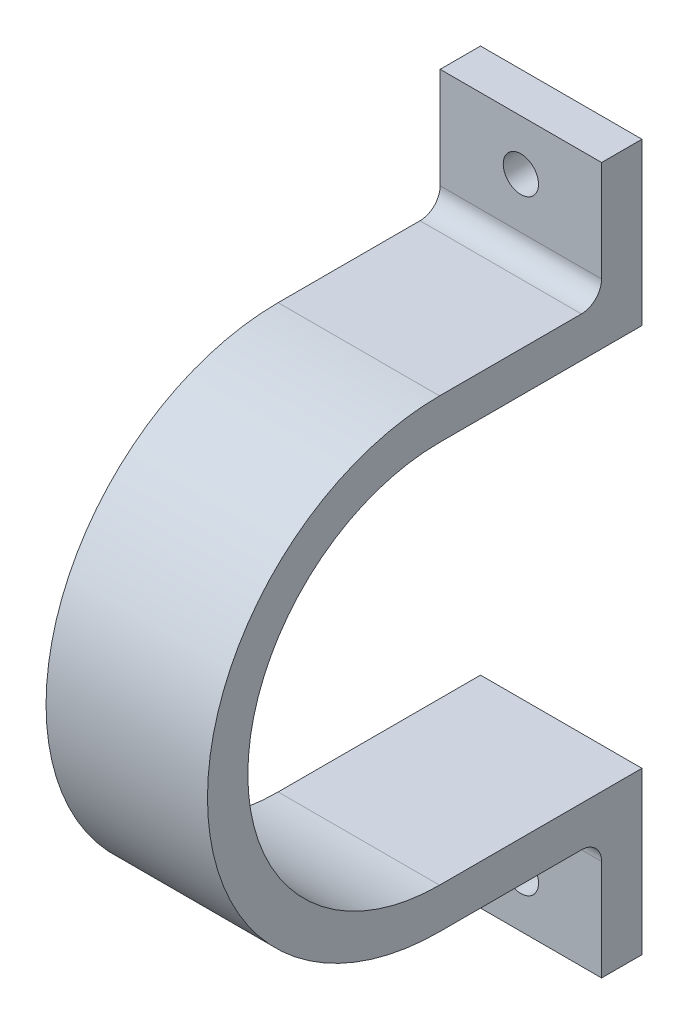
ISO-10303-21;
HEADER;
FILE_DESCRIPTION(('STEP AP214'),'2;1');
FILE_NAME('part.step','',(''),(''),'','','');
FILE_SCHEMA(('AUTOMOTIVE_DESIGN { 1 0 10303 214 1 1 1 1 }'));
ENDSEC;
DATA;
#1=APPLICATION_CONTEXT('core data for automotive mechanical design processes');
#2=APPLICATION_PROTOCOL_DEFINITION('international standard','automotive_design',2000,#1);
#3=PRODUCT_CONTEXT('',#1,'mechanical');
#4=PRODUCT('Part','Part','',(#3));
#5=PRODUCT_RELATED_PRODUCT_CATEGORY('part','',(#4));
#6=PRODUCT_DEFINITION_FORMATION('','',#4);
#7=PRODUCT_DEFINITION_CONTEXT('part definition',#1,'design');
#8=PRODUCT_DEFINITION('design','',#6,#7);
#9=PRODUCT_DEFINITION_SHAPE('','',#8);
#10=(LENGTH_UNIT() NAMED_UNIT(*) SI_UNIT(.MILLI.,.METRE.));
#11=(NAMED_UNIT(*) PLANE_ANGLE_UNIT() SI_UNIT($,.RADIAN.));
#12=(NAMED_UNIT(*) SI_UNIT($,.STERADIAN.) SOLID_ANGLE_UNIT());
#13=UNCERTAINTY_MEASURE_WITH_UNIT(LENGTH_MEASURE(1.E-05),#10,'distance_accuracy_value','');
#14=(GEOMETRIC_REPRESENTATION_CONTEXT(3) GLOBAL_UNCERTAINTY_ASSIGNED_CONTEXT((#13)) GLOBAL_UNIT_ASSIGNED_CONTEXT((#10,
#11,#12)) REPRESENTATION_CONTEXT('',''));
#15=CARTESIAN_POINT('',(0.,0.,0.));
#16=DIRECTION('',(0.,0.,1.));
#17=DIRECTION('',(1.,0.,0.));
#18=AXIS2_PLACEMENT_3D('',#15,#16,#17);
#19=CARTESIAN_POINT('',(16.,16.,0.));
#20=DIRECTION('',(0.,0.,1.));
#21=DIRECTION('',(0.,-1.,0.));
#22=AXIS2_PLACEMENT_3D('',#19,#20,#21);
#23=PLANE('',#22);
#24=CARTESIAN_POINT('',(8.,11.,0.));
#25=DIRECTION('',(0.,0.,-1.));
#26=DIRECTION('',(0.,-1.,0.));
#27=AXIS2_PLACEMENT_3D('',#24,#25,#26);
#28=CIRCLE('',#27,1.75);
#29=CARTESIAN_POINT('',(8.,9.24999999999999,0.));
#30=VERTEX_POINT('',#29);
#31=EDGE_CURVE('E326',#30,#30,#28,.T.);
#32=ORIENTED_EDGE('',*,*,#31,.F.);
#33=EDGE_LOOP('',(#32));
#34=FACE_BOUND('',#33,.T.);
#35=DIRECTION('',(0.,1.,0.));
#36=VECTOR('',#35,1.);
#37=CARTESIAN_POINT('',(0.,16.,0.));
#38=LINE('',#37,#36);
#39=CARTESIAN_POINT('',(0.,0.,0.));
#40=VERTEX_POINT('',#39);
#41=CARTESIAN_POINT('',(0.,16.,0.));
#42=VERTEX_POINT('',#41);
#43=EDGE_CURVE('E173',#40,#42,#38,.T.);
#44=ORIENTED_EDGE('',*,*,#43,.T.);
#45=DIRECTION('',(-1.,0.,0.));
#46=VECTOR('',#45,1.);
#47=CARTESIAN_POINT('',(16.,16.,0.));
#48=LINE('',#47,#46);
#49=CARTESIAN_POINT('',(16.,16.,0.));
#50=VERTEX_POINT('',#49);
#51=EDGE_CURVE('E151',#50,#42,#48,.T.);
#52=ORIENTED_EDGE('',*,*,#51,.F.);
#53=DIRECTION('',(0.,1.,0.));
#54=VECTOR('',#53,1.);
#55=CARTESIAN_POINT('',(16.,16.,0.));
#56=LINE('',#55,#54);
#57=CARTESIAN_POINT('',(16.,0.,0.));
#58=VERTEX_POINT('',#57);
#59=EDGE_CURVE('E160',#58,#50,#56,.T.);
#60=ORIENTED_EDGE('',*,*,#59,.F.);
#61=DIRECTION('',(-1.,0.,0.));
#62=VECTOR('',#61,1.);
#63=CARTESIAN_POINT('',(16.,0.,0.));
#64=LINE('',#63,#62);
#65=EDGE_CURVE('E256',#58,#40,#64,.T.);
#66=ORIENTED_EDGE('',*,*,#65,.T.);
#67=EDGE_LOOP('',(#44,#52,#60,#66));
#68=FACE_BOUND('',#67,.T.);
#69=ADVANCED_FACE('F45',(#34,#68),#23,.F.);
#70=CARTESIAN_POINT('',(16.,16.,4.));
#71=DIRECTION('',(0.,-1.,0.));
#72=DIRECTION('',(0.,0.,-1.));
#73=AXIS2_PLACEMENT_3D('',#70,#71,#72);
#74=PLANE('',#73);
#75=DIRECTION('',(0.,0.,1.));
#76=VECTOR('',#75,1.);
#77=CARTESIAN_POINT('',(0.,16.,4.));
#78=LINE('',#77,#76);
#79=CARTESIAN_POINT('',(0.,16.,4.));
#80=VERTEX_POINT('',#79);
#81=EDGE_CURVE('E225',#42,#80,#78,.T.);
#82=ORIENTED_EDGE('',*,*,#81,.T.);
#83=DIRECTION('',(-1.,0.,0.));
#84=VECTOR('',#83,1.);
#85=CARTESIAN_POINT('',(16.,16.,4.));
#86=LINE('',#85,#84);
#87=CARTESIAN_POINT('',(16.,16.,4.));
#88=VERTEX_POINT('',#87);
#89=EDGE_CURVE('E154',#88,#80,#86,.T.);
#90=ORIENTED_EDGE('',*,*,#89,.F.);
#91=DIRECTION('',(0.,0.,1.));
#92=VECTOR('',#91,1.);
#93=CARTESIAN_POINT('',(16.,16.,4.));
#94=LINE('',#93,#92);
#95=EDGE_CURVE('E147',#50,#88,#94,.T.);
#96=ORIENTED_EDGE('',*,*,#95,.F.);
#97=ORIENTED_EDGE('',*,*,#51,.T.);
#98=EDGE_LOOP('',(#82,#90,#96,#97));
#99=FACE_BOUND('',#98,.T.);
#100=ADVANCED_FACE('F149',(#99),#74,.F.);
#101=CARTESIAN_POINT('',(16.,4.,4.));
#102=DIRECTION('',(0.,0.,-1.));
#103=DIRECTION('',(0.,1.,0.));
#104=AXIS2_PLACEMENT_3D('',#101,#102,#103);
#105=PLANE('',#104);
#106=CARTESIAN_POINT('',(8.,11.,4.));
#107=DIRECTION('',(0.,0.,-1.));
#108=DIRECTION('',(0.,1.,0.));
#109=AXIS2_PLACEMENT_3D('',#106,#107,#108);
#110=CIRCLE('',#109,1.75);
#111=CARTESIAN_POINT('',(8.,12.75,4.));
#112=VERTEX_POINT('',#111);
#113=EDGE_CURVE('E329',#112,#112,#110,.F.);
#114=ORIENTED_EDGE('',*,*,#113,.F.);
#115=EDGE_LOOP('',(#114));
#116=FACE_BOUND('',#115,.T.);
#117=DIRECTION('',(0.,-1.,0.));
#118=VECTOR('',#117,1.);
#119=CARTESIAN_POINT('',(0.,4.,4.));
#120=LINE('',#119,#118);
#121=CARTESIAN_POINT('',(0.,6.,4.));
#122=VERTEX_POINT('',#121);
#123=EDGE_CURVE('E219',#80,#122,#120,.T.);
#124=ORIENTED_EDGE('',*,*,#123,.T.);
#125=DIRECTION('',(-1.,0.,0.));
#126=VECTOR('',#125,1.);
#127=CARTESIAN_POINT('',(16.,6.,4.));
#128=LINE('',#127,#126);
#129=CARTESIAN_POINT('',(16.,6.,4.));
#130=VERTEX_POINT('',#129);
#131=EDGE_CURVE('E180',#122,#130,#128,.F.);
#132=ORIENTED_EDGE('',*,*,#131,.T.);
#133=DIRECTION('',(0.,-1.,0.));
#134=VECTOR('',#133,1.);
#135=CARTESIAN_POINT('',(16.,4.,4.));
#136=LINE('',#135,#134);
#137=EDGE_CURVE('E159',#88,#130,#136,.T.);
#138=ORIENTED_EDGE('',*,*,#137,.F.);
#139=ORIENTED_EDGE('',*,*,#89,.T.);
#140=EDGE_LOOP('',(#124,#132,#138,#139));
#141=FACE_BOUND('',#140,.T.);
#142=ADVANCED_FACE('F223',(#116,#141),#105,.F.);
#143=CARTESIAN_POINT('',(16.,4.,20.0623887896835));
#144=DIRECTION('',(0.,-1.,0.));
#145=DIRECTION('',(0.,0.,-1.));
#146=AXIS2_PLACEMENT_3D('',#143,#144,#145);
#147=PLANE('',#146);
#148=DIRECTION('',(0.,0.,1.));
#149=VECTOR('',#148,1.);
#150=CARTESIAN_POINT('',(16.,4.,20.0623887896835));
#151=LINE('',#150,#149);
#152=CARTESIAN_POINT('',(16.,4.,6.));
#153=VERTEX_POINT('',#152);
#154=CARTESIAN_POINT('',(16.,3.99999999999999,20.0623887896835));
#155=VERTEX_POINT('',#154);
#156=EDGE_CURVE('E202',#153,#155,#151,.T.);
#157=ORIENTED_EDGE('',*,*,#156,.F.);
#158=DIRECTION('',(-1.,0.,0.));
#159=VECTOR('',#158,1.);
#160=CARTESIAN_POINT('',(0.,4.,6.));
#161=LINE('',#160,#159);
#162=CARTESIAN_POINT('',(0.,4.,6.));
#163=VERTEX_POINT('',#162);
#164=EDGE_CURVE('E175',#153,#163,#161,.T.);
#165=ORIENTED_EDGE('',*,*,#164,.T.);
#166=DIRECTION('',(0.,0.,1.));
#167=VECTOR('',#166,1.);
#168=CARTESIAN_POINT('',(0.,4.,20.0623887896835));
#169=LINE('',#168,#167);
#170=CARTESIAN_POINT('',(0.,3.99999999999999,20.0623887896835));
#171=VERTEX_POINT('',#170);
#172=EDGE_CURVE('E221',#163,#171,#169,.T.);
#173=ORIENTED_EDGE('',*,*,#172,.T.);
#174=DIRECTION('',(-1.,0.,0.));
#175=VECTOR('',#174,1.);
#176=CARTESIAN_POINT('',(16.,3.99999999999999,20.0623887896835));
#177=LINE('',#176,#175);
#178=EDGE_CURVE('E182',#155,#171,#177,.T.);
#179=ORIENTED_EDGE('',*,*,#178,.F.);
#180=EDGE_LOOP('',(#157,#165,#173,#179));
#181=FACE_BOUND('',#180,.T.);
#182=ADVANCED_FACE('F208',(#181),#147,.F.);
#183=CARTESIAN_POINT('',(16.,-19.,20.0623887896835));
#184=DIRECTION('',(-1.,0.,0.));
#185=DIRECTION('',(0.,0.,1.));
#186=AXIS2_PLACEMENT_3D('',#183,#184,#185);
#187=CYLINDRICAL_SURFACE('',#186,23.);
#188=CARTESIAN_POINT('',(0.,-19.,20.0623887896835));
#189=DIRECTION('',(1.,0.,0.));
#190=DIRECTION('',(0.,0.,1.));
#191=AXIS2_PLACEMENT_3D('',#188,#189,#190);
#192=CIRCLE('',#191,23.);
#193=CARTESIAN_POINT('',(0.,-42.,20.0623887896835));
#194=VERTEX_POINT('',#193);
#195=EDGE_CURVE('E229',#171,#194,#192,.T.);
#196=ORIENTED_EDGE('',*,*,#195,.T.);
#197=DIRECTION('',(-1.,0.,0.));
#198=VECTOR('',#197,1.);
#199=CARTESIAN_POINT('',(16.,-42.,20.0623887896835));
#200=LINE('',#199,#198);
#201=CARTESIAN_POINT('',(16.,-42.,20.0623887896835));
#202=VERTEX_POINT('',#201);
#203=EDGE_CURVE('E279',#202,#194,#200,.T.);
#204=ORIENTED_EDGE('',*,*,#203,.F.);
#205=CARTESIAN_POINT('',(16.,-19.,20.0623887896835));
#206=DIRECTION('',(1.,0.,0.));
#207=DIRECTION('',(0.,0.,1.));
#208=AXIS2_PLACEMENT_3D('',#205,#206,#207);
#209=CIRCLE('',#208,23.);
#210=EDGE_CURVE('E213',#155,#202,#209,.T.);
#211=ORIENTED_EDGE('',*,*,#210,.F.);
#212=ORIENTED_EDGE('',*,*,#178,.T.);
#213=EDGE_LOOP('',(#196,#204,#211,#212));
#214=FACE_BOUND('',#213,.T.);
#215=ADVANCED_FACE('F284',(#214),#187,.T.);
#216=CARTESIAN_POINT('',(16.,-42.,4.));
#217=DIRECTION('',(0.,1.,0.));
#218=DIRECTION('',(0.,0.,1.));
#219=AXIS2_PLACEMENT_3D('',#216,#217,#218);
#220=PLANE('',#219);
#221=DIRECTION('',(0.,0.,-1.));
#222=VECTOR('',#221,1.);
#223=CARTESIAN_POINT('',(0.,-42.,4.));
#224=LINE('',#223,#222);
#225=CARTESIAN_POINT('',(0.,-42.,6.));
#226=VERTEX_POINT('',#225);
#227=EDGE_CURVE('E236',#194,#226,#224,.T.);
#228=ORIENTED_EDGE('',*,*,#227,.T.);
#229=DIRECTION('',(-1.,0.,0.));
#230=VECTOR('',#229,1.);
#231=CARTESIAN_POINT('',(16.,-42.,6.));
#232=LINE('',#231,#230);
#233=CARTESIAN_POINT('',(16.,-42.,6.));
#234=VERTEX_POINT('',#233);
#235=EDGE_CURVE('E61',#226,#234,#232,.F.);
#236=ORIENTED_EDGE('',*,*,#235,.T.);
#237=DIRECTION('',(0.,0.,-1.));
#238=VECTOR('',#237,1.);
#239=CARTESIAN_POINT('',(16.,-42.,4.));
#240=LINE('',#239,#238);
#241=EDGE_CURVE('E293',#202,#234,#240,.T.);
#242=ORIENTED_EDGE('',*,*,#241,.F.);
#243=ORIENTED_EDGE('',*,*,#203,.T.);
#244=EDGE_LOOP('',(#228,#236,#242,#243));
#245=FACE_BOUND('',#244,.T.);
#246=ADVANCED_FACE('F286',(#245),#220,.F.);
#247=CARTESIAN_POINT('',(16.,-54.,4.));
#248=DIRECTION('',(0.,0.,-1.));
#249=DIRECTION('',(-1.,0.,0.));
#250=AXIS2_PLACEMENT_3D('',#247,#248,#249);
#251=PLANE('',#250);
#252=CARTESIAN_POINT('',(8.,-49.,4.));
#253=DIRECTION('',(0.,0.,-1.));
#254=DIRECTION('',(-1.,0.,0.));
#255=AXIS2_PLACEMENT_3D('',#252,#253,#254);
#256=CIRCLE('',#255,1.75);
#257=CARTESIAN_POINT('',(6.25,-49.,4.));
#258=VERTEX_POINT('',#257);
#259=EDGE_CURVE('E317',#258,#258,#256,.F.);
#260=ORIENTED_EDGE('',*,*,#259,.F.);
#261=EDGE_LOOP('',(#260));
#262=FACE_BOUND('',#261,.T.);
#263=DIRECTION('',(0.,-1.,0.));
#264=VECTOR('',#263,1.);
#265=CARTESIAN_POINT('',(16.,-54.,4.));
#266=LINE('',#265,#264);
#267=CARTESIAN_POINT('',(16.,-44.,4.));
#268=VERTEX_POINT('',#267);
#269=CARTESIAN_POINT('',(16.,-54.,4.));
#270=VERTEX_POINT('',#269);
#271=EDGE_CURVE('E291',#268,#270,#266,.T.);
#272=ORIENTED_EDGE('',*,*,#271,.F.);
#273=DIRECTION('',(-1.,0.,0.));
#274=VECTOR('',#273,1.);
#275=CARTESIAN_POINT('',(0.,-44.,4.));
#276=LINE('',#275,#274);
#277=CARTESIAN_POINT('',(0.,-44.,4.));
#278=VERTEX_POINT('',#277);
#279=EDGE_CURVE('E188',#268,#278,#276,.T.);
#280=ORIENTED_EDGE('',*,*,#279,.T.);
#281=DIRECTION('',(0.,-1.,0.));
#282=VECTOR('',#281,1.);
#283=CARTESIAN_POINT('',(0.,-54.,4.));
#284=LINE('',#283,#282);
#285=CARTESIAN_POINT('',(0.,-54.,4.));
#286=VERTEX_POINT('',#285);
#287=EDGE_CURVE('E239',#278,#286,#284,.T.);
#288=ORIENTED_EDGE('',*,*,#287,.T.);
#289=DIRECTION('',(-1.,0.,0.));
#290=VECTOR('',#289,1.);
#291=CARTESIAN_POINT('',(16.,-54.,4.));
#292=LINE('',#291,#290);
#293=EDGE_CURVE('E275',#270,#286,#292,.T.);
#294=ORIENTED_EDGE('',*,*,#293,.F.);
#295=EDGE_LOOP('',(#272,#280,#288,#294));
#296=FACE_BOUND('',#295,.T.);
#297=ADVANCED_FACE('F295',(#262,#296),#251,.F.);
#298=CARTESIAN_POINT('',(16.,-54.,0.));
#299=DIRECTION('',(0.,1.,0.));
#300=DIRECTION('',(0.,0.,1.));
#301=AXIS2_PLACEMENT_3D('',#298,#299,#300);
#302=PLANE('',#301);
#303=DIRECTION('',(0.,0.,-1.));
#304=VECTOR('',#303,1.);
#305=CARTESIAN_POINT('',(0.,-54.,0.));
#306=LINE('',#305,#304);
#307=CARTESIAN_POINT('',(0.,-54.,0.));
#308=VERTEX_POINT('',#307);
#309=EDGE_CURVE('E242',#286,#308,#306,.T.);
#310=ORIENTED_EDGE('',*,*,#309,.T.);
#311=DIRECTION('',(-1.,0.,0.));
#312=VECTOR('',#311,1.);
#313=CARTESIAN_POINT('',(16.,-54.,0.));
#314=LINE('',#313,#312);
#315=CARTESIAN_POINT('',(16.,-54.,0.));
#316=VERTEX_POINT('',#315);
#317=EDGE_CURVE('E271',#316,#308,#314,.T.);
#318=ORIENTED_EDGE('',*,*,#317,.F.);
#319=DIRECTION('',(0.,0.,-1.));
#320=VECTOR('',#319,1.);
#321=CARTESIAN_POINT('',(16.,-54.,0.));
#322=LINE('',#321,#320);
#323=EDGE_CURVE('E298',#270,#316,#322,.T.);
#324=ORIENTED_EDGE('',*,*,#323,.F.);
#325=ORIENTED_EDGE('',*,*,#293,.T.);
#326=EDGE_LOOP('',(#310,#318,#324,#325));
#327=FACE_BOUND('',#326,.T.);
#328=ADVANCED_FACE('F383',(#327),#302,.F.);
#329=CARTESIAN_POINT('',(16.,-38.,0.));
#330=DIRECTION('',(0.,0.,1.));
#331=DIRECTION('',(0.,-1.,0.));
#332=AXIS2_PLACEMENT_3D('',#329,#330,#331);
#333=PLANE('',#332);
#334=CARTESIAN_POINT('',(8.,-49.,0.));
#335=DIRECTION('',(0.,0.,-1.));
#336=DIRECTION('',(0.,1.,0.));
#337=AXIS2_PLACEMENT_3D('',#334,#335,#336);
#338=CIRCLE('',#337,1.75);
#339=CARTESIAN_POINT('',(8.,-47.25,0.));
#340=VERTEX_POINT('',#339);
#341=EDGE_CURVE('E320',#340,#340,#338,.T.);
#342=ORIENTED_EDGE('',*,*,#341,.F.);
#343=EDGE_LOOP('',(#342));
#344=FACE_BOUND('',#343,.T.);
#345=DIRECTION('',(0.,1.,0.));
#346=VECTOR('',#345,1.);
#347=CARTESIAN_POINT('',(0.,-38.,0.));
#348=LINE('',#347,#346);
#349=CARTESIAN_POINT('',(0.,-38.,0.));
#350=VERTEX_POINT('',#349);
#351=EDGE_CURVE('E245',#308,#350,#348,.T.);
#352=ORIENTED_EDGE('',*,*,#351,.T.);
#353=DIRECTION('',(-1.,0.,0.));
#354=VECTOR('',#353,1.);
#355=CARTESIAN_POINT('',(16.,-38.,0.));
#356=LINE('',#355,#354);
#357=CARTESIAN_POINT('',(16.,-38.,0.));
#358=VERTEX_POINT('',#357);
#359=EDGE_CURVE('E267',#358,#350,#356,.T.);
#360=ORIENTED_EDGE('',*,*,#359,.F.);
#361=DIRECTION('',(0.,1.,0.));
#362=VECTOR('',#361,1.);
#363=CARTESIAN_POINT('',(16.,-38.,0.));
#364=LINE('',#363,#362);
#365=EDGE_CURVE('E302',#316,#358,#364,.T.);
#366=ORIENTED_EDGE('',*,*,#365,.F.);
#367=ORIENTED_EDGE('',*,*,#317,.T.);
#368=EDGE_LOOP('',(#352,#360,#366,#367));
#369=FACE_BOUND('',#368,.T.);
#370=ADVANCED_FACE('F380',(#344,#369),#333,.F.);
#371=CARTESIAN_POINT('',(16.,-38.,20.0623887896835));
#372=DIRECTION('',(0.,-1.,0.));
#373=DIRECTION('',(0.,0.,-1.));
#374=AXIS2_PLACEMENT_3D('',#371,#372,#373);
#375=PLANE('',#374);
#376=DIRECTION('',(0.,0.,1.));
#377=VECTOR('',#376,1.);
#378=CARTESIAN_POINT('',(0.,-38.,20.0623887896835));
#379=LINE('',#378,#377);
#380=CARTESIAN_POINT('',(0.,-38.,20.0623887896835));
#381=VERTEX_POINT('',#380);
#382=EDGE_CURVE('E248',#350,#381,#379,.T.);
#383=ORIENTED_EDGE('',*,*,#382,.T.);
#384=DIRECTION('',(-1.,0.,0.));
#385=VECTOR('',#384,1.);
#386=CARTESIAN_POINT('',(16.,-38.,20.0623887896835));
#387=LINE('',#386,#385);
#388=CARTESIAN_POINT('',(16.,-38.,20.0623887896835));
#389=VERTEX_POINT('',#388);
#390=EDGE_CURVE('E263',#389,#381,#387,.T.);
#391=ORIENTED_EDGE('',*,*,#390,.F.);
#392=DIRECTION('',(0.,0.,1.));
#393=VECTOR('',#392,1.);
#394=CARTESIAN_POINT('',(16.,-38.,20.0623887896835));
#395=LINE('',#394,#393);
#396=EDGE_CURVE('E309',#358,#389,#395,.T.);
#397=ORIENTED_EDGE('',*,*,#396,.F.);
#398=ORIENTED_EDGE('',*,*,#359,.T.);
#399=EDGE_LOOP('',(#383,#391,#397,#398));
#400=FACE_BOUND('',#399,.T.);
#401=ADVANCED_FACE('F376',(#400),#375,.F.);
#402=CARTESIAN_POINT('',(16.,-19.,20.0623887896835));
#403=DIRECTION('',(-1.,0.,0.));
#404=DIRECTION('',(0.,0.,1.));
#405=AXIS2_PLACEMENT_3D('',#402,#403,#404);
#406=CYLINDRICAL_SURFACE('',#405,19.);
#407=CARTESIAN_POINT('',(0.,-19.,20.0623887896835));
#408=DIRECTION('',(-1.,0.,0.));
#409=DIRECTION('',(0.,0.,-1.));
#410=AXIS2_PLACEMENT_3D('',#407,#408,#409);
#411=CIRCLE('',#410,19.);
#412=CARTESIAN_POINT('',(0.,0.,20.0623887896835));
#413=VERTEX_POINT('',#412);
#414=EDGE_CURVE('E251',#381,#413,#411,.T.);
#415=ORIENTED_EDGE('',*,*,#414,.T.);
#416=DIRECTION('',(-1.,0.,0.));
#417=VECTOR('',#416,1.);
#418=CARTESIAN_POINT('',(16.,0.,20.0623887896835));
#419=LINE('',#418,#417);
#420=CARTESIAN_POINT('',(16.,0.,20.0623887896835));
#421=VERTEX_POINT('',#420);
#422=EDGE_CURVE('E259',#421,#413,#419,.T.);
#423=ORIENTED_EDGE('',*,*,#422,.F.);
#424=CARTESIAN_POINT('',(16.,-19.,20.0623887896835));
#425=DIRECTION('',(-1.,0.,0.));
#426=DIRECTION('',(0.,0.,-1.));
#427=AXIS2_PLACEMENT_3D('',#424,#425,#426);
#428=CIRCLE('',#427,19.);
#429=EDGE_CURVE('E312',#389,#421,#428,.T.);
#430=ORIENTED_EDGE('',*,*,#429,.F.);
#431=ORIENTED_EDGE('',*,*,#390,.T.);
#432=EDGE_LOOP('',(#415,#423,#430,#431));
#433=FACE_BOUND('',#432,.T.);
#434=ADVANCED_FACE('F372',(#433),#406,.F.);
#435=CARTESIAN_POINT('',(16.,0.,0.));
#436=DIRECTION('',(0.,1.,0.));
#437=DIRECTION('',(0.,0.,1.));
#438=AXIS2_PLACEMENT_3D('',#435,#436,#437);
#439=PLANE('',#438);
#440=DIRECTION('',(0.,0.,-1.));
#441=VECTOR('',#440,1.);
#442=CARTESIAN_POINT('',(0.,0.,0.));
#443=LINE('',#442,#441);
#444=EDGE_CURVE('E170',#413,#40,#443,.T.);
#445=ORIENTED_EDGE('',*,*,#444,.T.);
#446=ORIENTED_EDGE('',*,*,#65,.F.);
#447=DIRECTION('',(0.,0.,-1.));
#448=VECTOR('',#447,1.);
#449=CARTESIAN_POINT('',(16.,0.,0.));
#450=LINE('',#449,#448);
#451=EDGE_CURVE('E165',#421,#58,#450,.T.);
#452=ORIENTED_EDGE('',*,*,#451,.F.);
#453=ORIENTED_EDGE('',*,*,#422,.T.);
#454=EDGE_LOOP('',(#445,#446,#452,#453));
#455=FACE_BOUND('',#454,.T.);
#456=ADVANCED_FACE('F369',(#455),#439,.F.);
#457=CARTESIAN_POINT('',(16.,-19.,20.0623887896835));
#458=DIRECTION('',(1.,0.,0.));
#459=DIRECTION('',(0.,0.,-1.));
#460=AXIS2_PLACEMENT_3D('',#457,#458,#459);
#461=PLANE('',#460);
#462=ORIENTED_EDGE('',*,*,#59,.T.);
#463=ORIENTED_EDGE('',*,*,#95,.T.);
#464=ORIENTED_EDGE('',*,*,#137,.T.);
#465=CARTESIAN_POINT('',(16.,6.,6.));
#466=DIRECTION('',(1.,0.,0.));
#467=DIRECTION('',(0.,0.,-1.));
#468=AXIS2_PLACEMENT_3D('',#465,#466,#467);
#469=CIRCLE('',#468,2.);
#470=EDGE_CURVE('E197',#130,#153,#469,.F.);
#471=ORIENTED_EDGE('',*,*,#470,.T.);
#472=ORIENTED_EDGE('',*,*,#156,.T.);
#473=ORIENTED_EDGE('',*,*,#210,.T.);
#474=ORIENTED_EDGE('',*,*,#241,.T.);
#475=CARTESIAN_POINT('',(16.,-44.,6.));
#476=DIRECTION('',(1.,0.,0.));
#477=DIRECTION('',(0.,0.,-1.));
#478=AXIS2_PLACEMENT_3D('',#475,#476,#477);
#479=CIRCLE('',#478,2.);
#480=EDGE_CURVE('E11',#234,#268,#479,.F.);
#481=ORIENTED_EDGE('',*,*,#480,.T.);
#482=ORIENTED_EDGE('',*,*,#271,.T.);
#483=ORIENTED_EDGE('',*,*,#323,.T.);
#484=ORIENTED_EDGE('',*,*,#365,.T.);
#485=ORIENTED_EDGE('',*,*,#396,.T.);
#486=ORIENTED_EDGE('',*,*,#429,.T.);
#487=ORIENTED_EDGE('',*,*,#451,.T.);
#488=EDGE_LOOP('',(#462,#463,#464,#471,#472,#473,#474,#481,#482,#483,#484,#485,#486,#487));
#489=FACE_BOUND('',#488,.T.);
#490=ADVANCED_FACE('F163',(#489),#461,.T.);
#491=CARTESIAN_POINT('',(0.,-19.,20.0623887896835));
#492=DIRECTION('',(1.,0.,0.));
#493=DIRECTION('',(0.,0.,-1.));
#494=AXIS2_PLACEMENT_3D('',#491,#492,#493);
#495=PLANE('',#494);
#496=ORIENTED_EDGE('',*,*,#43,.F.);
#497=ORIENTED_EDGE('',*,*,#444,.F.);
#498=ORIENTED_EDGE('',*,*,#414,.F.);
#499=ORIENTED_EDGE('',*,*,#382,.F.);
#500=ORIENTED_EDGE('',*,*,#351,.F.);
#501=ORIENTED_EDGE('',*,*,#309,.F.);
#502=ORIENTED_EDGE('',*,*,#287,.F.);
#503=CARTESIAN_POINT('',(0.,-44.,6.));
#504=DIRECTION('',(1.,0.,0.));
#505=DIRECTION('',(0.,0.,-1.));
#506=AXIS2_PLACEMENT_3D('',#503,#504,#505);
#507=CIRCLE('',#506,2.);
#508=EDGE_CURVE('E54',#278,#226,#507,.T.);
#509=ORIENTED_EDGE('',*,*,#508,.T.);
#510=ORIENTED_EDGE('',*,*,#227,.F.);
#511=ORIENTED_EDGE('',*,*,#195,.F.);
#512=ORIENTED_EDGE('',*,*,#172,.F.);
#513=CARTESIAN_POINT('',(0.,6.,6.));
#514=DIRECTION('',(1.,0.,0.));
#515=DIRECTION('',(0.,0.,-1.));
#516=AXIS2_PLACEMENT_3D('',#513,#514,#515);
#517=CIRCLE('',#516,2.);
#518=EDGE_CURVE('E194',#163,#122,#517,.T.);
#519=ORIENTED_EDGE('',*,*,#518,.T.);
#520=ORIENTED_EDGE('',*,*,#123,.F.);
#521=ORIENTED_EDGE('',*,*,#81,.F.);
#522=EDGE_LOOP('',(#496,#497,#498,#499,#500,#501,#502,#509,#510,#511,#512,#519,#520,#521));
#523=FACE_BOUND('',#522,.T.);
#524=ADVANCED_FACE('F218',(#523),#495,.F.);
#525=CARTESIAN_POINT('',(8.,-49.,43.0633887896835));
#526=DIRECTION('',(0.,0.,-1.));
#527=DIRECTION('',(0.,1.,0.));
#528=AXIS2_PLACEMENT_3D('',#525,#526,#527);
#529=CYLINDRICAL_SURFACE('',#528,1.75);
#530=ORIENTED_EDGE('',*,*,#341,.T.);
#531=EDGE_LOOP('',(#530));
#532=FACE_BOUND('',#531,.T.);
#533=ORIENTED_EDGE('',*,*,#259,.T.);
#534=EDGE_LOOP('',(#533));
#535=FACE_BOUND('',#534,.T.);
#536=ADVANCED_FACE('F358',(#532,#535),#529,.F.);
#537=CARTESIAN_POINT('',(8.,11.,43.0633887896835));
#538=DIRECTION('',(0.,0.,-1.));
#539=DIRECTION('',(0.,1.,0.));
#540=AXIS2_PLACEMENT_3D('',#537,#538,#539);
#541=CYLINDRICAL_SURFACE('',#540,1.75);
#542=ORIENTED_EDGE('',*,*,#31,.T.);
#543=EDGE_LOOP('',(#542));
#544=FACE_BOUND('',#543,.T.);
#545=ORIENTED_EDGE('',*,*,#113,.T.);
#546=EDGE_LOOP('',(#545));
#547=FACE_BOUND('',#546,.T.);
#548=ADVANCED_FACE('F340',(#544,#547),#541,.F.);
#549=CARTESIAN_POINT('',(16.,6.,6.));
#550=DIRECTION('',(1.,0.,0.));
#551=DIRECTION('',(0.,0.,-1.));
#552=AXIS2_PLACEMENT_3D('',#549,#550,#551);
#553=CYLINDRICAL_SURFACE('',#552,2.);
#554=ORIENTED_EDGE('',*,*,#470,.F.);
#555=ORIENTED_EDGE('',*,*,#131,.F.);
#556=ORIENTED_EDGE('',*,*,#518,.F.);
#557=ORIENTED_EDGE('',*,*,#164,.F.);
#558=EDGE_LOOP('',(#554,#555,#556,#557));
#559=FACE_BOUND('',#558,.T.);
#560=ADVANCED_FACE('F215',(#559),#553,.F.);
#561=CARTESIAN_POINT('',(16.,-44.,6.));
#562=DIRECTION('',(1.,0.,0.));
#563=DIRECTION('',(0.,0.,-1.));
#564=AXIS2_PLACEMENT_3D('',#561,#562,#563);
#565=CYLINDRICAL_SURFACE('',#564,2.);
#566=ORIENTED_EDGE('',*,*,#480,.F.);
#567=ORIENTED_EDGE('',*,*,#235,.F.);
#568=ORIENTED_EDGE('',*,*,#508,.F.);
#569=ORIENTED_EDGE('',*,*,#279,.F.);
#570=EDGE_LOOP('',(#566,#567,#568,#569));
#571=FACE_BOUND('',#570,.T.);
#572=ADVANCED_FACE('F47',(#571),#565,.F.);
#573=CLOSED_SHELL('',(#69,#100,#142,#182,#215,#246,#297,#328,#370,#401,#434,#456,#490,#524,#536,
#548,#560,#572));
#574=MANIFOLD_SOLID_BREP('B2',#573);
#575=ADVANCED_BREP_SHAPE_REPRESENTATION('',(#18,#574),#14);
#576=SHAPE_DEFINITION_REPRESENTATION(#9,#575);
ENDSEC;
END-ISO-10303-21;
